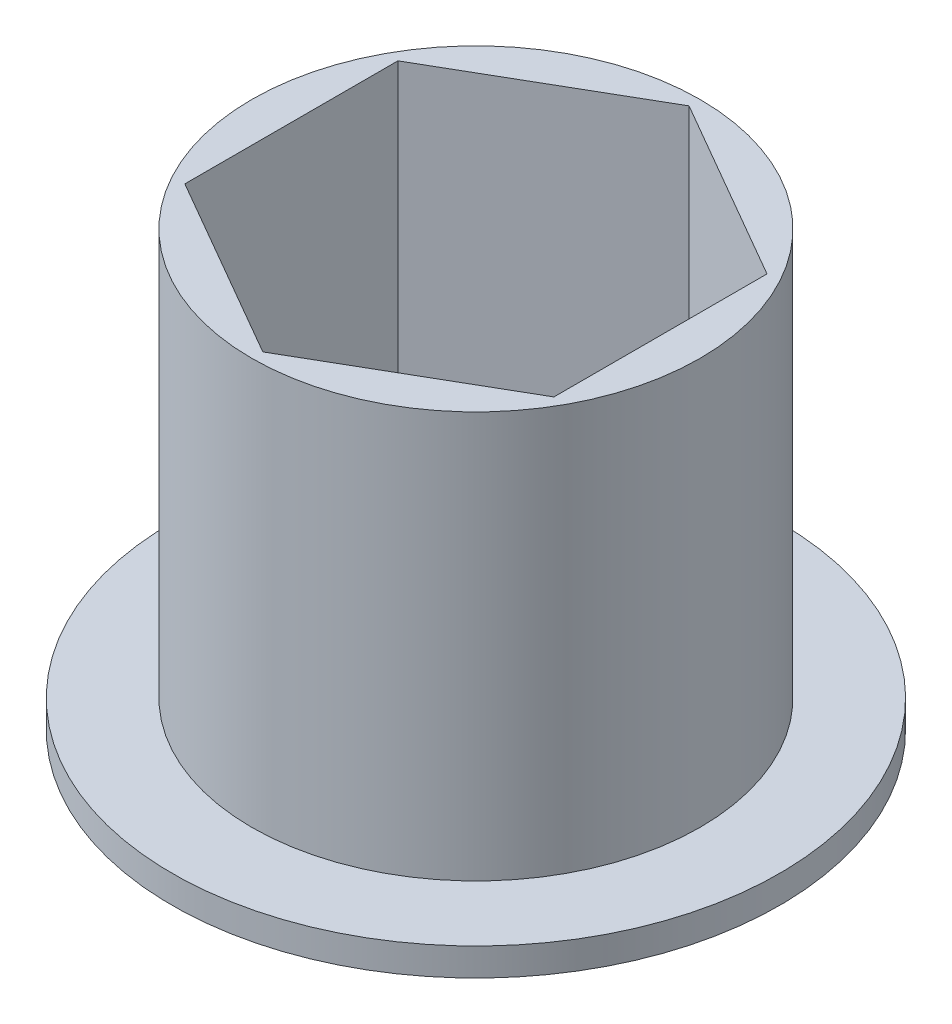
ISO-10303-21;
HEADER;
FILE_DESCRIPTION(('STEP AP214'),'2;1');
FILE_NAME('part.step','',(''),(''),'','','');
FILE_SCHEMA(('AUTOMOTIVE_DESIGN { 1 0 10303 214 1 1 1 1 }'));
ENDSEC;
DATA;
#1=APPLICATION_CONTEXT('core data for automotive mechanical design processes');
#2=APPLICATION_PROTOCOL_DEFINITION('international standard','automotive_design',2000,#1);
#3=PRODUCT_CONTEXT('',#1,'mechanical');
#4=PRODUCT('Part','Part','',(#3));
#5=PRODUCT_RELATED_PRODUCT_CATEGORY('part','',(#4));
#6=PRODUCT_DEFINITION_FORMATION('','',#4);
#7=PRODUCT_DEFINITION_CONTEXT('part definition',#1,'design');
#8=PRODUCT_DEFINITION('design','',#6,#7);
#9=PRODUCT_DEFINITION_SHAPE('','',#8);
#10=(LENGTH_UNIT() NAMED_UNIT(*) SI_UNIT(.MILLI.,.METRE.));
#11=(NAMED_UNIT(*) PLANE_ANGLE_UNIT() SI_UNIT($,.RADIAN.));
#12=(NAMED_UNIT(*) SI_UNIT($,.STERADIAN.) SOLID_ANGLE_UNIT());
#13=UNCERTAINTY_MEASURE_WITH_UNIT(LENGTH_MEASURE(1.E-05),#10,'distance_accuracy_value','');
#14=(GEOMETRIC_REPRESENTATION_CONTEXT(3) GLOBAL_UNCERTAINTY_ASSIGNED_CONTEXT((#13)) GLOBAL_UNIT_ASSIGNED_CONTEXT((#10,
#11,#12)) REPRESENTATION_CONTEXT('',''));
#15=CARTESIAN_POINT('',(0.,0.,0.));
#16=DIRECTION('',(0.,0.,1.));
#17=DIRECTION('',(1.,0.,0.));
#18=AXIS2_PLACEMENT_3D('',#15,#16,#17);
#19=CARTESIAN_POINT('',(2.53125,11.90625,-4.38425360665872));
#20=DIRECTION('',(-0.5,0.,0.866025403784439));
#21=DIRECTION('',(0.866025403784439,0.,0.5));
#22=AXIS2_PLACEMENT_3D('',#19,#20,#21);
#23=PLANE('',#22);
#24=DIRECTION('',(-0.866025403784439,0.,-0.5));
#25=VECTOR('',#24,1.);
#26=CARTESIAN_POINT('',(2.53125,0.,-4.38425360665872));
#27=LINE('',#26,#25);
#28=CARTESIAN_POINT('',(5.0625,0.,-2.92283573777248));
#29=VERTEX_POINT('',#28);
#30=CARTESIAN_POINT('',(0.,0.,-5.84567147554496));
#31=VERTEX_POINT('',#30);
#32=EDGE_CURVE('E118',#29,#31,#27,.T.);
#33=ORIENTED_EDGE('',*,*,#32,.F.);
#34=DIRECTION('',(0.,-1.,0.));
#35=VECTOR('',#34,1.);
#36=CARTESIAN_POINT('',(5.0625,11.90625,-2.92283573777248));
#37=LINE('',#36,#35);
#38=CARTESIAN_POINT('',(5.0625,11.90625,-2.92283573777248));
#39=VERTEX_POINT('',#38);
#40=EDGE_CURVE('E11',#39,#29,#37,.T.);
#41=ORIENTED_EDGE('',*,*,#40,.F.);
#42=DIRECTION('',(-0.866025403784439,0.,-0.5));
#43=VECTOR('',#42,1.);
#44=CARTESIAN_POINT('',(2.53125,11.90625,-4.38425360665872));
#45=LINE('',#44,#43);
#46=CARTESIAN_POINT('',(0.,11.90625,-5.84567147554496));
#47=VERTEX_POINT('',#46);
#48=EDGE_CURVE('E133',#39,#47,#45,.T.);
#49=ORIENTED_EDGE('',*,*,#48,.T.);
#50=DIRECTION('',(0.,-1.,0.));
#51=VECTOR('',#50,1.);
#52=CARTESIAN_POINT('',(0.,11.90625,-5.84567147554496));
#53=LINE('',#52,#51);
#54=EDGE_CURVE('E49',#47,#31,#53,.T.);
#55=ORIENTED_EDGE('',*,*,#54,.T.);
#56=EDGE_LOOP('',(#33,#41,#49,#55));
#57=FACE_BOUND('',#56,.T.);
#58=ADVANCED_FACE('F33',(#57),#23,.T.);
#59=CARTESIAN_POINT('',(5.0625,11.90625,0.));
#60=DIRECTION('',(-1.,0.,0.));
#61=DIRECTION('',(0.,0.,1.));
#62=AXIS2_PLACEMENT_3D('',#59,#60,#61);
#63=PLANE('',#62);
#64=DIRECTION('',(0.,0.,-1.));
#65=VECTOR('',#64,1.);
#66=CARTESIAN_POINT('',(5.0625,0.,0.));
#67=LINE('',#66,#65);
#68=CARTESIAN_POINT('',(5.0625,0.,2.92283573777248));
#69=VERTEX_POINT('',#68);
#70=EDGE_CURVE('E120',#69,#29,#67,.T.);
#71=ORIENTED_EDGE('',*,*,#70,.F.);
#72=DIRECTION('',(0.,-1.,0.));
#73=VECTOR('',#72,1.);
#74=CARTESIAN_POINT('',(5.0625,11.90625,2.92283573777248));
#75=LINE('',#74,#73);
#76=CARTESIAN_POINT('',(5.0625,11.90625,2.92283573777248));
#77=VERTEX_POINT('',#76);
#78=EDGE_CURVE('E41',#77,#69,#75,.T.);
#79=ORIENTED_EDGE('',*,*,#78,.F.);
#80=DIRECTION('',(0.,0.,-1.));
#81=VECTOR('',#80,1.);
#82=CARTESIAN_POINT('',(5.0625,11.90625,0.));
#83=LINE('',#82,#81);
#84=EDGE_CURVE('E239',#77,#39,#83,.T.);
#85=ORIENTED_EDGE('',*,*,#84,.T.);
#86=ORIENTED_EDGE('',*,*,#40,.T.);
#87=EDGE_LOOP('',(#71,#79,#85,#86));
#88=FACE_BOUND('',#87,.T.);
#89=ADVANCED_FACE('F142',(#88),#63,.T.);
#90=CARTESIAN_POINT('',(2.53125,11.90625,4.38425360665872));
#91=DIRECTION('',(-0.5,0.,-0.866025403784439));
#92=DIRECTION('',(-0.866025403784439,0.,0.5));
#93=AXIS2_PLACEMENT_3D('',#90,#91,#92);
#94=PLANE('',#93);
#95=DIRECTION('',(0.866025403784439,0.,-0.5));
#96=VECTOR('',#95,1.);
#97=CARTESIAN_POINT('',(2.53125,0.,4.38425360665872));
#98=LINE('',#97,#96);
#99=CARTESIAN_POINT('',(0.,0.,5.84567147554496));
#100=VERTEX_POINT('',#99);
#101=EDGE_CURVE('E124',#100,#69,#98,.T.);
#102=ORIENTED_EDGE('',*,*,#101,.F.);
#103=DIRECTION('',(0.,-1.,0.));
#104=VECTOR('',#103,1.);
#105=CARTESIAN_POINT('',(0.,11.90625,5.84567147554496));
#106=LINE('',#105,#104);
#107=CARTESIAN_POINT('',(0.,11.90625,5.84567147554496));
#108=VERTEX_POINT('',#107);
#109=EDGE_CURVE('E96',#108,#100,#106,.T.);
#110=ORIENTED_EDGE('',*,*,#109,.F.);
#111=DIRECTION('',(0.866025403784439,0.,-0.5));
#112=VECTOR('',#111,1.);
#113=CARTESIAN_POINT('',(2.53125,11.90625,4.38425360665872));
#114=LINE('',#113,#112);
#115=EDGE_CURVE('E107',#108,#77,#114,.T.);
#116=ORIENTED_EDGE('',*,*,#115,.T.);
#117=ORIENTED_EDGE('',*,*,#78,.T.);
#118=EDGE_LOOP('',(#102,#110,#116,#117));
#119=FACE_BOUND('',#118,.T.);
#120=ADVANCED_FACE('F139',(#119),#94,.T.);
#121=CARTESIAN_POINT('',(-2.53125,11.90625,4.38425360665872));
#122=DIRECTION('',(0.5,0.,-0.866025403784439));
#123=DIRECTION('',(-0.866025403784439,0.,-0.5));
#124=AXIS2_PLACEMENT_3D('',#121,#122,#123);
#125=PLANE('',#124);
#126=DIRECTION('',(0.866025403784439,0.,0.5));
#127=VECTOR('',#126,1.);
#128=CARTESIAN_POINT('',(-2.53125,0.,4.38425360665872));
#129=LINE('',#128,#127);
#130=CARTESIAN_POINT('',(-5.0625,0.,2.92283573777248));
#131=VERTEX_POINT('',#130);
#132=EDGE_CURVE('E92',#131,#100,#129,.T.);
#133=ORIENTED_EDGE('',*,*,#132,.F.);
#134=DIRECTION('',(0.,-1.,0.));
#135=VECTOR('',#134,1.);
#136=CARTESIAN_POINT('',(-5.0625,11.90625,2.92283573777248));
#137=LINE('',#136,#135);
#138=CARTESIAN_POINT('',(-5.0625,11.90625,2.92283573777248));
#139=VERTEX_POINT('',#138);
#140=EDGE_CURVE('E87',#139,#131,#137,.T.);
#141=ORIENTED_EDGE('',*,*,#140,.F.);
#142=DIRECTION('',(0.866025403784439,0.,0.5));
#143=VECTOR('',#142,1.);
#144=CARTESIAN_POINT('',(-2.53125,11.90625,4.38425360665872));
#145=LINE('',#144,#143);
#146=EDGE_CURVE('E90',#139,#108,#145,.T.);
#147=ORIENTED_EDGE('',*,*,#146,.T.);
#148=ORIENTED_EDGE('',*,*,#109,.T.);
#149=EDGE_LOOP('',(#133,#141,#147,#148));
#150=FACE_BOUND('',#149,.T.);
#151=ADVANCED_FACE('F89',(#150),#125,.T.);
#152=CARTESIAN_POINT('',(-5.0625,11.90625,0.));
#153=DIRECTION('',(1.,0.,0.));
#154=DIRECTION('',(0.,0.,-1.));
#155=AXIS2_PLACEMENT_3D('',#152,#153,#154);
#156=PLANE('',#155);
#157=DIRECTION('',(0.,0.,1.));
#158=VECTOR('',#157,1.);
#159=CARTESIAN_POINT('',(-5.0625,0.,0.));
#160=LINE('',#159,#158);
#161=CARTESIAN_POINT('',(-5.0625,0.,-2.92283573777248));
#162=VERTEX_POINT('',#161);
#163=EDGE_CURVE('E128',#162,#131,#160,.T.);
#164=ORIENTED_EDGE('',*,*,#163,.F.);
#165=DIRECTION('',(0.,-1.,0.));
#166=VECTOR('',#165,1.);
#167=CARTESIAN_POINT('',(-5.0625,11.90625,-2.92283573777248));
#168=LINE('',#167,#166);
#169=CARTESIAN_POINT('',(-5.0625,11.90625,-2.92283573777248));
#170=VERTEX_POINT('',#169);
#171=EDGE_CURVE('E68',#170,#162,#168,.T.);
#172=ORIENTED_EDGE('',*,*,#171,.F.);
#173=DIRECTION('',(0.,0.,1.));
#174=VECTOR('',#173,1.);
#175=CARTESIAN_POINT('',(-5.0625,11.90625,0.));
#176=LINE('',#175,#174);
#177=EDGE_CURVE('E104',#170,#139,#176,.T.);
#178=ORIENTED_EDGE('',*,*,#177,.T.);
#179=ORIENTED_EDGE('',*,*,#140,.T.);
#180=EDGE_LOOP('',(#164,#172,#178,#179));
#181=FACE_BOUND('',#180,.T.);
#182=ADVANCED_FACE('F109',(#181),#156,.T.);
#183=CARTESIAN_POINT('',(-2.53125,11.90625,-4.38425360665872));
#184=DIRECTION('',(0.5,0.,0.866025403784438));
#185=DIRECTION('',(0.866025403784439,0.,-0.5));
#186=AXIS2_PLACEMENT_3D('',#183,#184,#185);
#187=PLANE('',#186);
#188=DIRECTION('',(-0.866025403784439,0.,0.5));
#189=VECTOR('',#188,1.);
#190=CARTESIAN_POINT('',(-2.53125,0.,-4.38425360665872));
#191=LINE('',#190,#189);
#192=EDGE_CURVE('E130',#31,#162,#191,.T.);
#193=ORIENTED_EDGE('',*,*,#192,.F.);
#194=ORIENTED_EDGE('',*,*,#54,.F.);
#195=DIRECTION('',(-0.866025403784439,0.,0.5));
#196=VECTOR('',#195,1.);
#197=CARTESIAN_POINT('',(-2.53125,11.90625,-4.38425360665872));
#198=LINE('',#197,#196);
#199=EDGE_CURVE('E110',#47,#170,#198,.T.);
#200=ORIENTED_EDGE('',*,*,#199,.T.);
#201=ORIENTED_EDGE('',*,*,#171,.T.);
#202=EDGE_LOOP('',(#193,#194,#200,#201));
#203=FACE_BOUND('',#202,.T.);
#204=ADVANCED_FACE('F146',(#203),#187,.T.);
#205=CARTESIAN_POINT('',(0.,11.90625,0.));
#206=DIRECTION('',(0.,-1.,0.));
#207=DIRECTION('',(0.,0.,-1.));
#208=AXIS2_PLACEMENT_3D('',#205,#206,#207);
#209=CYLINDRICAL_SURFACE('',#208,6.15);
#210=CARTESIAN_POINT('',(0.,0.762,0.));
#211=DIRECTION('',(0.,1.,0.));
#212=DIRECTION('',(0.,0.,1.));
#213=AXIS2_PLACEMENT_3D('',#210,#211,#212);
#214=CIRCLE('',#213,6.15);
#215=CARTESIAN_POINT('',(0.,0.762,6.15));
#216=VERTEX_POINT('',#215);
#217=EDGE_CURVE('E229',#216,#216,#214,.T.);
#218=ORIENTED_EDGE('',*,*,#217,.T.);
#219=EDGE_LOOP('',(#218));
#220=FACE_BOUND('',#219,.T.);
#221=CARTESIAN_POINT('',(0.,11.90625,0.));
#222=DIRECTION('',(0.,1.,0.));
#223=DIRECTION('',(0.,0.,1.));
#224=AXIS2_PLACEMENT_3D('',#221,#222,#223);
#225=CIRCLE('',#224,6.15);
#226=CARTESIAN_POINT('',(0.,11.90625,6.15));
#227=VERTEX_POINT('',#226);
#228=EDGE_CURVE('E112',#227,#227,#225,.T.);
#229=ORIENTED_EDGE('',*,*,#228,.F.);
#230=EDGE_LOOP('',(#229));
#231=FACE_BOUND('',#230,.T.);
#232=ADVANCED_FACE('F148',(#220,#231),#209,.T.);
#233=CARTESIAN_POINT('',(0.,11.90625,0.));
#234=DIRECTION('',(0.,1.,0.));
#235=DIRECTION('',(0.,0.,1.));
#236=AXIS2_PLACEMENT_3D('',#233,#234,#235);
#237=PLANE('',#236);
#238=ORIENTED_EDGE('',*,*,#48,.F.);
#239=ORIENTED_EDGE('',*,*,#84,.F.);
#240=ORIENTED_EDGE('',*,*,#115,.F.);
#241=ORIENTED_EDGE('',*,*,#146,.F.);
#242=ORIENTED_EDGE('',*,*,#177,.F.);
#243=ORIENTED_EDGE('',*,*,#199,.F.);
#244=EDGE_LOOP('',(#238,#239,#240,#241,#242,#243));
#245=FACE_BOUND('',#244,.T.);
#246=ORIENTED_EDGE('',*,*,#228,.T.);
#247=EDGE_LOOP('',(#246));
#248=FACE_BOUND('',#247,.T.);
#249=ADVANCED_FACE('F101',(#245,#248),#237,.T.);
#250=CARTESIAN_POINT('',(0.,0.,0.));
#251=DIRECTION('',(0.,1.,0.));
#252=DIRECTION('',(0.,0.,1.));
#253=AXIS2_PLACEMENT_3D('',#250,#251,#252);
#254=PLANE('',#253);
#255=ORIENTED_EDGE('',*,*,#32,.T.);
#256=ORIENTED_EDGE('',*,*,#192,.T.);
#257=ORIENTED_EDGE('',*,*,#163,.T.);
#258=ORIENTED_EDGE('',*,*,#132,.T.);
#259=ORIENTED_EDGE('',*,*,#101,.T.);
#260=ORIENTED_EDGE('',*,*,#70,.T.);
#261=EDGE_LOOP('',(#255,#256,#257,#258,#259,#260));
#262=FACE_BOUND('',#261,.T.);
#263=CARTESIAN_POINT('',(0.,0.,0.));
#264=DIRECTION('',(0.,1.,0.));
#265=DIRECTION('',(0.,0.,1.));
#266=AXIS2_PLACEMENT_3D('',#263,#264,#265);
#267=CIRCLE('',#266,8.334375);
#268=CARTESIAN_POINT('',(0.,0.,-8.334375));
#269=VERTEX_POINT('',#268);
#270=EDGE_CURVE('E233',#269,#269,#267,.T.);
#271=ORIENTED_EDGE('',*,*,#270,.F.);
#272=EDGE_LOOP('',(#271));
#273=FACE_BOUND('',#272,.T.);
#274=ADVANCED_FACE('F144',(#262,#273),#254,.F.);
#275=CARTESIAN_POINT('',(0.,0.762,0.));
#276=DIRECTION('',(0.,-1.,0.));
#277=DIRECTION('',(0.,0.,-1.));
#278=AXIS2_PLACEMENT_3D('',#275,#276,#277);
#279=CYLINDRICAL_SURFACE('',#278,8.334375);
#280=CARTESIAN_POINT('',(0.,0.762,0.));
#281=DIRECTION('',(0.,1.,0.));
#282=DIRECTION('',(0.,0.,1.));
#283=AXIS2_PLACEMENT_3D('',#280,#281,#282);
#284=CIRCLE('',#283,8.334375);
#285=CARTESIAN_POINT('',(0.,0.762,-8.334375));
#286=VERTEX_POINT('',#285);
#287=EDGE_CURVE('E121',#286,#286,#284,.T.);
#288=CARTESIAN_POINT('',(0.,0.762,-8.334375));
#289=CARTESIAN_POINT('',(0.,0.7540625,-8.334375));
#290=CARTESIAN_POINT('',(0.,0.746125,-8.334375));
#291=CARTESIAN_POINT('',(0.,0.73025,-8.334375));
#292=CARTESIAN_POINT('',(0.,0.7223125,-8.334375));
#293=CARTESIAN_POINT('',(0.,0.7064375,-8.334375));
#294=CARTESIAN_POINT('',(0.,0.6985,-8.334375));
#295=CARTESIAN_POINT('',(0.,0.682625,-8.334375));
#296=CARTESIAN_POINT('',(0.,0.6746875,-8.334375));
#297=CARTESIAN_POINT('',(0.,0.6588125,-8.334375));
#298=CARTESIAN_POINT('',(0.,0.650875,-8.334375));
#299=CARTESIAN_POINT('',(0.,0.635,-8.334375));
#300=CARTESIAN_POINT('',(0.,0.6270625,-8.334375));
#301=CARTESIAN_POINT('',(0.,0.6111875,-8.334375));
#302=CARTESIAN_POINT('',(0.,0.60325,-8.334375));
#303=CARTESIAN_POINT('',(0.,0.587375,-8.334375));
#304=CARTESIAN_POINT('',(0.,0.5794375,-8.334375));
#305=CARTESIAN_POINT('',(0.,0.5635625,-8.334375));
#306=CARTESIAN_POINT('',(0.,0.555625,-8.334375));
#307=CARTESIAN_POINT('',(0.,0.53975,-8.334375));
#308=CARTESIAN_POINT('',(0.,0.5318125,-8.334375));
#309=CARTESIAN_POINT('',(0.,0.5159375,-8.334375));
#310=CARTESIAN_POINT('',(0.,0.508,-8.334375));
#311=CARTESIAN_POINT('',(0.,0.492125,-8.334375));
#312=CARTESIAN_POINT('',(0.,0.4841875,-8.334375));
#313=CARTESIAN_POINT('',(0.,0.4683125,-8.334375));
#314=CARTESIAN_POINT('',(0.,0.460375,-8.334375));
#315=CARTESIAN_POINT('',(0.,0.4445,-8.334375));
#316=CARTESIAN_POINT('',(0.,0.4365625,-8.334375));
#317=CARTESIAN_POINT('',(0.,0.4206875,-8.334375));
#318=CARTESIAN_POINT('',(0.,0.41275,-8.334375));
#319=CARTESIAN_POINT('',(0.,0.396875,-8.334375));
#320=CARTESIAN_POINT('',(0.,0.3889375,-8.334375));
#321=CARTESIAN_POINT('',(0.,0.3730625,-8.334375));
#322=CARTESIAN_POINT('',(0.,0.365125,-8.334375));
#323=CARTESIAN_POINT('',(0.,0.34925,-8.334375));
#324=CARTESIAN_POINT('',(0.,0.3413125,-8.334375));
#325=CARTESIAN_POINT('',(0.,0.3254375,-8.334375));
#326=CARTESIAN_POINT('',(0.,0.3175,-8.334375));
#327=CARTESIAN_POINT('',(0.,0.301625,-8.334375));
#328=CARTESIAN_POINT('',(0.,0.2936875,-8.334375));
#329=CARTESIAN_POINT('',(0.,0.2778125,-8.334375));
#330=CARTESIAN_POINT('',(0.,0.269875,-8.334375));
#331=CARTESIAN_POINT('',(0.,0.254,-8.334375));
#332=CARTESIAN_POINT('',(0.,0.2460625,-8.334375));
#333=CARTESIAN_POINT('',(0.,0.2301875,-8.334375));
#334=CARTESIAN_POINT('',(0.,0.22225,-8.334375));
#335=CARTESIAN_POINT('',(0.,0.206375,-8.334375));
#336=CARTESIAN_POINT('',(0.,0.1984375,-8.334375));
#337=CARTESIAN_POINT('',(0.,0.1825625,-8.334375));
#338=CARTESIAN_POINT('',(0.,0.174625,-8.334375));
#339=CARTESIAN_POINT('',(0.,0.15875,-8.334375));
#340=CARTESIAN_POINT('',(0.,0.1508125,-8.334375));
#341=CARTESIAN_POINT('',(0.,0.1349375,-8.334375));
#342=CARTESIAN_POINT('',(0.,0.127,-8.334375));
#343=CARTESIAN_POINT('',(0.,0.111125,-8.334375));
#344=CARTESIAN_POINT('',(0.,0.1031875,-8.334375));
#345=CARTESIAN_POINT('',(0.,0.0873125,-8.334375));
#346=CARTESIAN_POINT('',(0.,0.079375,-8.334375));
#347=CARTESIAN_POINT('',(0.,0.0635,-8.334375));
#348=CARTESIAN_POINT('',(0.,0.0555625,-8.334375));
#349=CARTESIAN_POINT('',(0.,0.0396875,-8.334375));
#350=CARTESIAN_POINT('',(0.,0.03175,-8.334375));
#351=CARTESIAN_POINT('',(0.,0.015875,-8.334375));
#352=CARTESIAN_POINT('',(0.,0.00793749999999999,-8.334375));
#353=CARTESIAN_POINT('',(0.,0.,-8.334375));
#354=B_SPLINE_CURVE_WITH_KNOTS('',3,(#288,#289,#290,#291,#292,#293,#294,#295,#296,#297,#298,
#299,#300,#301,#302,#303,#304,#305,#306,#307,#308,#309,#310,#311,#312,#313,#314,#315,#316,#317,
#318,#319,#320,#321,#322,#323,#324,#325,#326,#327,#328,#329,#330,#331,#332,#333,#334,#335,#336,
#337,#338,#339,#340,#341,#342,#343,#344,#345,#346,#347,#348,#349,#350,#351,#352,#353),
.UNSPECIFIED.,.F.,.F.,(4,2,2,2,2,2,2,2,2,2,2,2,2,2,2,2,2,2,2,2,2,2,2,2,2,2,2,2,2,2,2,2,4),(0.,
0.0238125,0.0476249999999999,0.0714374999999999,0.09525,0.1190625,0.142875,0.1666875,0.1905,
0.2143125,0.238125,0.2619375,0.28575,0.3095625,0.333375,0.3571875,0.381,0.4048125,0.428625,
0.4524375,0.47625,0.5000625,0.523875,0.5476875,0.5715,0.5953125,0.619125,0.6429375,0.66675,
0.6905625,0.714375,0.7381875,0.762),.UNSPECIFIED.);
#355=EDGE_CURVE('BSEAM203',#286,#269,#354,.T.);
#356=ORIENTED_EDGE('',*,*,#287,.F.);
#357=ORIENTED_EDGE('',*,*,#270,.T.);
#358=ORIENTED_EDGE('',*,*,#355,.T.);
#359=ORIENTED_EDGE('',*,*,#355,.F.);
#360=EDGE_LOOP('',(#356,#358,#357,#359));
#361=FACE_BOUND('',#360,.T.);
#362=ADVANCED_FACE('F203',(#361),#279,.T.);
#363=CARTESIAN_POINT('',(0.,0.762,0.));
#364=DIRECTION('',(0.,1.,0.));
#365=DIRECTION('',(0.,0.,1.));
#366=AXIS2_PLACEMENT_3D('',#363,#364,#365);
#367=PLANE('',#366);
#368=ORIENTED_EDGE('',*,*,#217,.F.);
#369=EDGE_LOOP('',(#368));
#370=FACE_BOUND('',#369,.T.);
#371=ORIENTED_EDGE('',*,*,#287,.T.);
#372=EDGE_LOOP('',(#371));
#373=FACE_BOUND('',#372,.T.);
#374=ADVANCED_FACE('F212',(#370,#373),#367,.T.);
#375=CLOSED_SHELL('',(#58,#89,#120,#151,#182,#204,#232,#249,#274,#362,#374));
#376=MANIFOLD_SOLID_BREP('B2',#375);
#377=ADVANCED_BREP_SHAPE_REPRESENTATION('',(#18,#376),#14);
#378=SHAPE_DEFINITION_REPRESENTATION(#9,#377);
ENDSEC;
END-ISO-10303-21;
